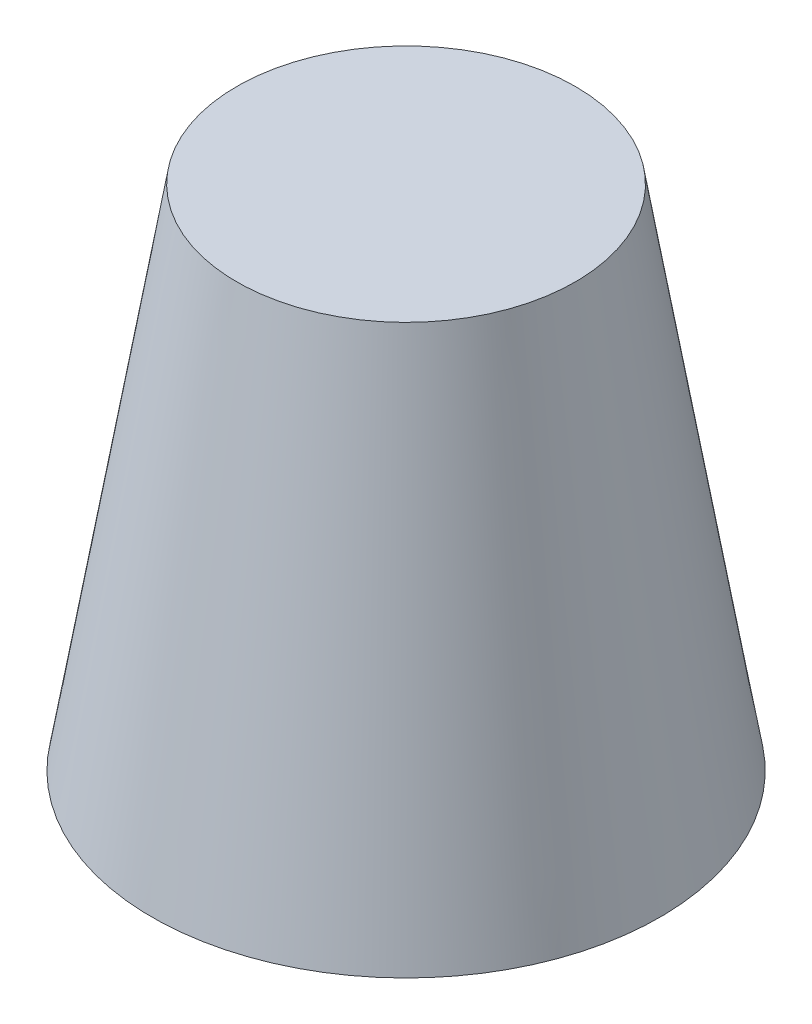
ISO-10303-21;
HEADER;
FILE_DESCRIPTION(('STEP AP214'),'2;1');
FILE_NAME('part.step','',(''),(''),'','','');
FILE_SCHEMA(('AUTOMOTIVE_DESIGN { 1 0 10303 214 1 1 1 1 }'));
ENDSEC;
DATA;
#1=APPLICATION_CONTEXT('core data for automotive mechanical design processes');
#2=APPLICATION_PROTOCOL_DEFINITION('international standard','automotive_design',2000,#1);
#3=PRODUCT_CONTEXT('',#1,'mechanical');
#4=PRODUCT('Part','Part','',(#3));
#5=PRODUCT_RELATED_PRODUCT_CATEGORY('part','',(#4));
#6=PRODUCT_DEFINITION_FORMATION('','',#4);
#7=PRODUCT_DEFINITION_CONTEXT('part definition',#1,'design');
#8=PRODUCT_DEFINITION('design','',#6,#7);
#9=PRODUCT_DEFINITION_SHAPE('','',#8);
#10=(LENGTH_UNIT() NAMED_UNIT(*) SI_UNIT(.MILLI.,.METRE.));
#11=(NAMED_UNIT(*) PLANE_ANGLE_UNIT() SI_UNIT($,.RADIAN.));
#12=(NAMED_UNIT(*) SI_UNIT($,.STERADIAN.) SOLID_ANGLE_UNIT());
#13=UNCERTAINTY_MEASURE_WITH_UNIT(LENGTH_MEASURE(1.E-05),#10,'distance_accuracy_value','');
#14=(GEOMETRIC_REPRESENTATION_CONTEXT(3) GLOBAL_UNCERTAINTY_ASSIGNED_CONTEXT((#13)) GLOBAL_UNIT_ASSIGNED_CONTEXT((#10,
#11,#12)) REPRESENTATION_CONTEXT('',''));
#15=CARTESIAN_POINT('',(0.,0.,0.));
#16=DIRECTION('',(0.,0.,1.));
#17=DIRECTION('',(1.,0.,0.));
#18=AXIS2_PLACEMENT_3D('',#15,#16,#17);
#19=CARTESIAN_POINT('',(0.,0.,0.));
#20=DIRECTION('',(0.,-1.,0.));
#21=DIRECTION('',(0.,0.,-1.));
#22=AXIS2_PLACEMENT_3D('',#19,#20,#21);
#23=CONICAL_SURFACE('',#22,25.,0.254368058553266);
#24=CARTESIAN_POINT('',(0.,3.,0.));
#25=DIRECTION('',(0.,-1.,0.));
#26=DIRECTION('',(0.,0.,-1.));
#27=AXIS2_PLACEMENT_3D('',#24,#25,#26);
#28=CIRCLE('',#27,24.22);
#29=CARTESIAN_POINT('',(0.,3.,-24.22));
#30=VERTEX_POINT('',#29);
#31=EDGE_CURVE('E70',#30,#30,#28,.T.);
#32=ORIENTED_EDGE('',*,*,#31,.F.);
#33=EDGE_LOOP('',(#32));
#34=FACE_BOUND('',#33,.T.);
#35=CARTESIAN_POINT('',(0.,0.,0.));
#36=DIRECTION('',(0.,-1.,0.));
#37=DIRECTION('',(0.,0.,-1.));
#38=AXIS2_PLACEMENT_3D('',#35,#36,#37);
#39=CIRCLE('',#38,25.);
#40=CARTESIAN_POINT('',(0.,0.,-25.));
#41=VERTEX_POINT('',#40);
#42=EDGE_CURVE('E10',#41,#41,#39,.T.);
#43=ORIENTED_EDGE('',*,*,#42,.T.);
#44=EDGE_LOOP('',(#43));
#45=FACE_BOUND('',#44,.T.);
#46=ADVANCED_FACE('F43',(#34,#45),#23,.F.);
#47=CARTESIAN_POINT('',(0.,0.,0.));
#48=DIRECTION('',(0.,1.,0.));
#49=DIRECTION('',(0.,0.,1.));
#50=AXIS2_PLACEMENT_3D('',#47,#48,#49);
#51=PLANE('',#50);
#52=ORIENTED_EDGE('',*,*,#42,.F.);
#53=EDGE_LOOP('',(#52));
#54=FACE_BOUND('',#53,.T.);
#55=CARTESIAN_POINT('',(0.,0.,0.));
#56=DIRECTION('',(0.,-1.,0.));
#57=DIRECTION('',(0.,0.,-1.));
#58=AXIS2_PLACEMENT_3D('',#55,#56,#57);
#59=CIRCLE('',#58,30.);
#60=CARTESIAN_POINT('',(0.,0.,-30.));
#61=VERTEX_POINT('',#60);
#62=EDGE_CURVE('E50',#61,#61,#59,.T.);
#63=ORIENTED_EDGE('',*,*,#62,.T.);
#64=EDGE_LOOP('',(#63));
#65=FACE_BOUND('',#64,.T.);
#66=ADVANCED_FACE('F79',(#54,#65),#51,.F.);
#67=CARTESIAN_POINT('',(0.,60.,0.));
#68=DIRECTION('',(0.,-1.,0.));
#69=DIRECTION('',(0.,0.,-1.));
#70=AXIS2_PLACEMENT_3D('',#67,#68,#69);
#71=CONICAL_SURFACE('',#70,20.,0.165148677414627);
#72=ORIENTED_EDGE('',*,*,#62,.F.);
#73=EDGE_LOOP('',(#72));
#74=FACE_BOUND('',#73,.T.);
#75=CARTESIAN_POINT('',(0.,60.,0.));
#76=DIRECTION('',(0.,-1.,0.));
#77=DIRECTION('',(0.,0.,-1.));
#78=AXIS2_PLACEMENT_3D('',#75,#76,#77);
#79=CIRCLE('',#78,20.);
#80=CARTESIAN_POINT('',(0.,60.,-20.));
#81=VERTEX_POINT('',#80);
#82=EDGE_CURVE('E55',#81,#81,#79,.T.);
#83=ORIENTED_EDGE('',*,*,#82,.T.);
#84=EDGE_LOOP('',(#83));
#85=FACE_BOUND('',#84,.T.);
#86=ADVANCED_FACE('F83',(#74,#85),#71,.T.);
#87=CARTESIAN_POINT('',(0.,60.,0.));
#88=DIRECTION('',(0.,-1.,0.));
#89=DIRECTION('',(0.,0.,-1.));
#90=AXIS2_PLACEMENT_3D('',#87,#88,#89);
#91=PLANE('',#90);
#92=ORIENTED_EDGE('',*,*,#82,.F.);
#93=EDGE_LOOP('',(#92));
#94=FACE_BOUND('',#93,.T.);
#95=ADVANCED_FACE('F88',(#94),#91,.F.);
#96=CARTESIAN_POINT('',(0.,57.,0.));
#97=DIRECTION('',(0.,1.,0.));
#98=DIRECTION('',(0.,0.,1.));
#99=AXIS2_PLACEMENT_3D('',#96,#97,#98);
#100=PLANE('',#99);
#101=CARTESIAN_POINT('',(0.,57.,0.));
#102=DIRECTION('',(0.,-1.,0.));
#103=DIRECTION('',(0.,0.,-1.));
#104=AXIS2_PLACEMENT_3D('',#101,#102,#103);
#105=CIRCLE('',#104,17.4586187348509);
#106=CARTESIAN_POINT('',(0.,57.,-17.4586187348509));
#107=VERTEX_POINT('',#106);
#108=EDGE_CURVE('E60',#107,#107,#105,.T.);
#109=ORIENTED_EDGE('',*,*,#108,.T.);
#110=EDGE_LOOP('',(#109));
#111=FACE_BOUND('',#110,.T.);
#112=ADVANCED_FACE('F94',(#111),#100,.F.);
#113=CARTESIAN_POINT('',(0.,57.,0.));
#114=DIRECTION('',(0.,-1.,0.));
#115=DIRECTION('',(0.,0.,-1.));
#116=AXIS2_PLACEMENT_3D('',#113,#114,#115);
#117=CONICAL_SURFACE('',#116,17.4586187348509,0.165148677414627);
#118=CARTESIAN_POINT('',(0.,3.,0.));
#119=DIRECTION('',(0.,-1.,0.));
#120=DIRECTION('',(0.,0.,-1.));
#121=AXIS2_PLACEMENT_3D('',#118,#119,#120);
#122=CIRCLE('',#121,26.4586187348509);
#123=CARTESIAN_POINT('',(0.,3.,-26.4586187348509));
#124=VERTEX_POINT('',#123);
#125=EDGE_CURVE('E66',#124,#124,#122,.T.);
#126=ORIENTED_EDGE('',*,*,#125,.T.);
#127=EDGE_LOOP('',(#126));
#128=FACE_BOUND('',#127,.T.);
#129=ORIENTED_EDGE('',*,*,#108,.F.);
#130=EDGE_LOOP('',(#129));
#131=FACE_BOUND('',#130,.T.);
#132=ADVANCED_FACE('F98',(#128,#131),#117,.F.);
#133=CARTESIAN_POINT('',(0.,3.,0.));
#134=DIRECTION('',(0.,1.,0.));
#135=DIRECTION('',(0.,0.,1.));
#136=AXIS2_PLACEMENT_3D('',#133,#134,#135);
#137=PLANE('',#136);
#138=ORIENTED_EDGE('',*,*,#31,.T.);
#139=EDGE_LOOP('',(#138));
#140=FACE_BOUND('',#139,.T.);
#141=ORIENTED_EDGE('',*,*,#125,.F.);
#142=EDGE_LOOP('',(#141));
#143=FACE_BOUND('',#142,.T.);
#144=ADVANCED_FACE('F75',(#140,#143),#137,.T.);
#145=CLOSED_SHELL('',(#46,#66,#86,#95,#112,#132,#144));
#146=MANIFOLD_SOLID_BREP('B2',#145);
#147=ADVANCED_BREP_SHAPE_REPRESENTATION('',(#18,#146),#14);
#148=SHAPE_DEFINITION_REPRESENTATION(#9,#147);
ENDSEC;
END-ISO-10303-21;
